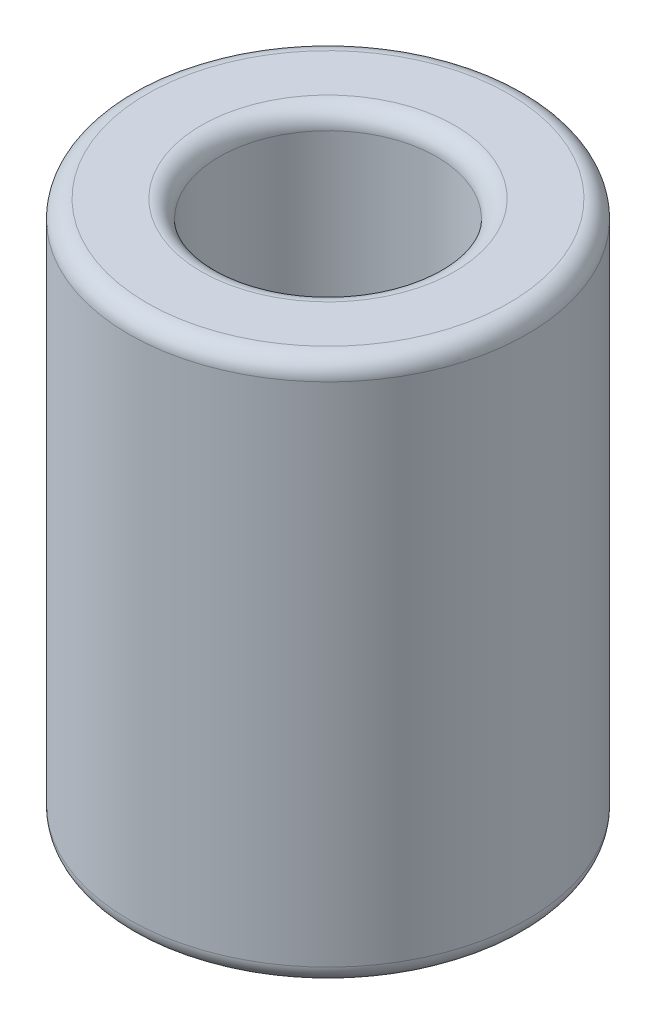
ISO-10303-21;
HEADER;
FILE_DESCRIPTION(('STEP AP214'),'2;1');
FILE_NAME('part.step','',(''),(''),'','','');
FILE_SCHEMA(('AUTOMOTIVE_DESIGN { 1 0 10303 214 1 1 1 1 }'));
ENDSEC;
DATA;
#1=APPLICATION_CONTEXT('core data for automotive mechanical design processes');
#2=APPLICATION_PROTOCOL_DEFINITION('international standard','automotive_design',2000,#1);
#3=PRODUCT_CONTEXT('',#1,'mechanical');
#4=PRODUCT('Part','Part','',(#3));
#5=PRODUCT_RELATED_PRODUCT_CATEGORY('part','',(#4));
#6=PRODUCT_DEFINITION_FORMATION('','',#4);
#7=PRODUCT_DEFINITION_CONTEXT('part definition',#1,'design');
#8=PRODUCT_DEFINITION('design','',#6,#7);
#9=PRODUCT_DEFINITION_SHAPE('','',#8);
#10=(LENGTH_UNIT() NAMED_UNIT(*) SI_UNIT(.MILLI.,.METRE.));
#11=(NAMED_UNIT(*) PLANE_ANGLE_UNIT() SI_UNIT($,.RADIAN.));
#12=(NAMED_UNIT(*) SI_UNIT($,.STERADIAN.) SOLID_ANGLE_UNIT());
#13=UNCERTAINTY_MEASURE_WITH_UNIT(LENGTH_MEASURE(1.E-05),#10,'distance_accuracy_value','');
#14=(GEOMETRIC_REPRESENTATION_CONTEXT(3) GLOBAL_UNCERTAINTY_ASSIGNED_CONTEXT((#13)) GLOBAL_UNIT_ASSIGNED_CONTEXT((#10,
#11,#12)) REPRESENTATION_CONTEXT('',''));
#15=CARTESIAN_POINT('',(0.,0.,0.));
#16=DIRECTION('',(0.,0.,1.));
#17=DIRECTION('',(1.,0.,0.));
#18=AXIS2_PLACEMENT_3D('',#15,#16,#17);
#19=CARTESIAN_POINT('',(0.,30.,0.));
#20=DIRECTION('',(0.,-1.,0.));
#21=DIRECTION('',(0.,0.,-1.));
#22=AXIS2_PLACEMENT_3D('',#19,#20,#21);
#23=CYLINDRICAL_SURFACE('',#22,11.);
#24=CARTESIAN_POINT('',(0.,1.,0.));
#25=DIRECTION('',(0.,1.,0.));
#26=DIRECTION('',(0.,0.,1.));
#27=AXIS2_PLACEMENT_3D('',#24,#25,#26);
#28=CIRCLE('',#27,11.);
#29=CARTESIAN_POINT('',(0.,1.,11.));
#30=VERTEX_POINT('',#29);
#31=EDGE_CURVE('E42',#30,#30,#28,.T.);
#32=ORIENTED_EDGE('',*,*,#31,.T.);
#33=EDGE_LOOP('',(#32));
#34=FACE_BOUND('',#33,.T.);
#35=CARTESIAN_POINT('',(0.,29.,0.));
#36=DIRECTION('',(0.,1.,0.));
#37=DIRECTION('',(0.,0.,1.));
#38=AXIS2_PLACEMENT_3D('',#35,#36,#37);
#39=CIRCLE('',#38,11.);
#40=CARTESIAN_POINT('',(0.,29.,11.));
#41=VERTEX_POINT('',#40);
#42=EDGE_CURVE('E46',#41,#41,#39,.F.);
#43=ORIENTED_EDGE('',*,*,#42,.T.);
#44=EDGE_LOOP('',(#43));
#45=FACE_BOUND('',#44,.T.);
#46=ADVANCED_FACE('F31',(#34,#45),#23,.T.);
#47=CARTESIAN_POINT('',(0.,30.,0.));
#48=DIRECTION('',(0.,1.,0.));
#49=DIRECTION('',(0.,0.,1.));
#50=AXIS2_PLACEMENT_3D('',#47,#48,#49);
#51=PLANE('',#50);
#52=CARTESIAN_POINT('',(0.,30.,0.));
#53=DIRECTION('',(0.,1.,0.));
#54=DIRECTION('',(0.,0.,1.));
#55=AXIS2_PLACEMENT_3D('',#52,#53,#54);
#56=CIRCLE('',#55,7.);
#57=CARTESIAN_POINT('',(0.,30.,7.));
#58=VERTEX_POINT('',#57);
#59=EDGE_CURVE('E10',#58,#58,#56,.F.);
#60=ORIENTED_EDGE('',*,*,#59,.T.);
#61=EDGE_LOOP('',(#60));
#62=FACE_BOUND('',#61,.T.);
#63=CARTESIAN_POINT('',(0.,30.,0.));
#64=DIRECTION('',(0.,1.,0.));
#65=DIRECTION('',(0.,0.,1.));
#66=AXIS2_PLACEMENT_3D('',#63,#64,#65);
#67=CIRCLE('',#66,10.);
#68=CARTESIAN_POINT('',(0.,30.,10.));
#69=VERTEX_POINT('',#68);
#70=EDGE_CURVE('E38',#69,#69,#67,.T.);
#71=ORIENTED_EDGE('',*,*,#70,.T.);
#72=EDGE_LOOP('',(#71));
#73=FACE_BOUND('',#72,.T.);
#74=ADVANCED_FACE('F76',(#62,#73),#51,.T.);
#75=CARTESIAN_POINT('',(0.,0.,0.));
#76=DIRECTION('',(0.,1.,0.));
#77=DIRECTION('',(0.,0.,1.));
#78=AXIS2_PLACEMENT_3D('',#75,#76,#77);
#79=PLANE('',#78);
#80=CARTESIAN_POINT('',(0.,0.,0.));
#81=DIRECTION('',(0.,1.,0.));
#82=DIRECTION('',(0.,0.,1.));
#83=AXIS2_PLACEMENT_3D('',#80,#81,#82);
#84=CIRCLE('',#83,7.);
#85=CARTESIAN_POINT('',(0.,0.,7.));
#86=VERTEX_POINT('',#85);
#87=EDGE_CURVE('E57',#86,#86,#84,.T.);
#88=ORIENTED_EDGE('',*,*,#87,.T.);
#89=EDGE_LOOP('',(#88));
#90=FACE_BOUND('',#89,.T.);
#91=CARTESIAN_POINT('',(0.,0.,0.));
#92=DIRECTION('',(0.,1.,0.));
#93=DIRECTION('',(0.,0.,1.));
#94=AXIS2_PLACEMENT_3D('',#91,#92,#93);
#95=CIRCLE('',#94,10.);
#96=CARTESIAN_POINT('',(0.,0.,10.));
#97=VERTEX_POINT('',#96);
#98=EDGE_CURVE('E60',#97,#97,#95,.F.);
#99=ORIENTED_EDGE('',*,*,#98,.T.);
#100=EDGE_LOOP('',(#99));
#101=FACE_BOUND('',#100,.T.);
#102=ADVANCED_FACE('F64',(#90,#101),#79,.F.);
#103=CARTESIAN_POINT('',(0.,0.,0.));
#104=DIRECTION('',(0.,1.,0.));
#105=DIRECTION('',(0.,0.,1.));
#106=AXIS2_PLACEMENT_3D('',#103,#104,#105);
#107=CYLINDRICAL_SURFACE('',#106,6.);
#108=CARTESIAN_POINT('',(0.,1.,0.));
#109=DIRECTION('',(0.,1.,0.));
#110=DIRECTION('',(0.,0.,1.));
#111=AXIS2_PLACEMENT_3D('',#108,#109,#110);
#112=CIRCLE('',#111,6.);
#113=CARTESIAN_POINT('',(0.,1.,6.));
#114=VERTEX_POINT('',#113);
#115=EDGE_CURVE('E51',#114,#114,#112,.F.);
#116=ORIENTED_EDGE('',*,*,#115,.T.);
#117=EDGE_LOOP('',(#116));
#118=FACE_BOUND('',#117,.T.);
#119=CARTESIAN_POINT('',(0.,29.,0.));
#120=DIRECTION('',(0.,1.,0.));
#121=DIRECTION('',(0.,0.,1.));
#122=AXIS2_PLACEMENT_3D('',#119,#120,#121);
#123=CIRCLE('',#122,6.);
#124=CARTESIAN_POINT('',(0.,29.,6.));
#125=VERTEX_POINT('',#124);
#126=EDGE_CURVE('E54',#125,#125,#123,.T.);
#127=ORIENTED_EDGE('',*,*,#126,.T.);
#128=EDGE_LOOP('',(#127));
#129=FACE_BOUND('',#128,.T.);
#130=ADVANCED_FACE('F91',(#118,#129),#107,.F.);
#131=CARTESIAN_POINT('',(0.,1.,0.));
#132=DIRECTION('',(0.,1.,0.));
#133=DIRECTION('',(0.,0.,1.));
#134=AXIS2_PLACEMENT_3D('',#131,#132,#133);
#135=TOROIDAL_SURFACE('',#134,7.,1.);
#136=ORIENTED_EDGE('',*,*,#115,.F.);
#137=EDGE_LOOP('',(#136));
#138=FACE_BOUND('',#137,.T.);
#139=ORIENTED_EDGE('',*,*,#87,.F.);
#140=EDGE_LOOP('',(#139));
#141=FACE_BOUND('',#140,.T.);
#142=ADVANCED_FACE('F70',(#138,#141),#135,.T.);
#143=CARTESIAN_POINT('',(0.,1.,0.));
#144=DIRECTION('',(0.,1.,0.));
#145=DIRECTION('',(0.,0.,1.));
#146=AXIS2_PLACEMENT_3D('',#143,#144,#145);
#147=TOROIDAL_SURFACE('',#146,10.,1.);
#148=ORIENTED_EDGE('',*,*,#98,.F.);
#149=EDGE_LOOP('',(#148));
#150=FACE_BOUND('',#149,.T.);
#151=ORIENTED_EDGE('',*,*,#31,.F.);
#152=EDGE_LOOP('',(#151));
#153=FACE_BOUND('',#152,.T.);
#154=ADVANCED_FACE('F66',(#150,#153),#147,.T.);
#155=CARTESIAN_POINT('',(0.,29.,0.));
#156=DIRECTION('',(0.,1.,0.));
#157=DIRECTION('',(0.,0.,1.));
#158=AXIS2_PLACEMENT_3D('',#155,#156,#157);
#159=TOROIDAL_SURFACE('',#158,7.,1.);
#160=ORIENTED_EDGE('',*,*,#59,.F.);
#161=EDGE_LOOP('',(#160));
#162=FACE_BOUND('',#161,.T.);
#163=ORIENTED_EDGE('',*,*,#126,.F.);
#164=EDGE_LOOP('',(#163));
#165=FACE_BOUND('',#164,.T.);
#166=ADVANCED_FACE('F69',(#162,#165),#159,.T.);
#167=CARTESIAN_POINT('',(0.,29.,0.));
#168=DIRECTION('',(0.,1.,0.));
#169=DIRECTION('',(0.,0.,1.));
#170=AXIS2_PLACEMENT_3D('',#167,#168,#169);
#171=TOROIDAL_SURFACE('',#170,10.,1.);
#172=ORIENTED_EDGE('',*,*,#42,.F.);
#173=EDGE_LOOP('',(#172));
#174=FACE_BOUND('',#173,.T.);
#175=ORIENTED_EDGE('',*,*,#70,.F.);
#176=EDGE_LOOP('',(#175));
#177=FACE_BOUND('',#176,.T.);
#178=ADVANCED_FACE('F33',(#174,#177),#171,.T.);
#179=CLOSED_SHELL('',(#46,#74,#102,#130,#142,#154,#166,#178));
#180=MANIFOLD_SOLID_BREP('B2',#179);
#181=ADVANCED_BREP_SHAPE_REPRESENTATION('',(#18,#180),#14);
#182=SHAPE_DEFINITION_REPRESENTATION(#9,#181);
ENDSEC;
END-ISO-10303-21;
